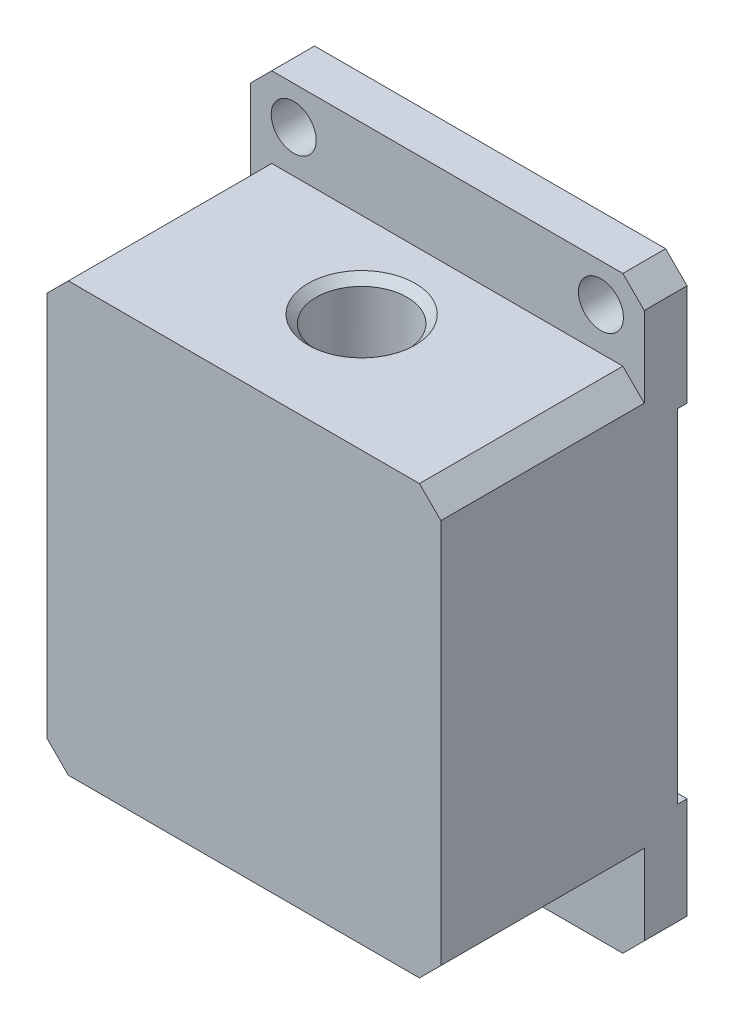
ISO-10303-21;
HEADER;
FILE_DESCRIPTION(('STEP AP214'),'2;1');
FILE_NAME('part.step','',(''),(''),'','','');
FILE_SCHEMA(('AUTOMOTIVE_DESIGN { 1 0 10303 214 1 1 1 1 }'));
ENDSEC;
DATA;
#1=APPLICATION_CONTEXT('core data for automotive mechanical design processes');
#2=APPLICATION_PROTOCOL_DEFINITION('international standard','automotive_design',2000,#1);
#3=PRODUCT_CONTEXT('',#1,'mechanical');
#4=PRODUCT('Part','Part','',(#3));
#5=PRODUCT_RELATED_PRODUCT_CATEGORY('part','',(#4));
#6=PRODUCT_DEFINITION_FORMATION('','',#4);
#7=PRODUCT_DEFINITION_CONTEXT('part definition',#1,'design');
#8=PRODUCT_DEFINITION('design','',#6,#7);
#9=PRODUCT_DEFINITION_SHAPE('','',#8);
#10=(LENGTH_UNIT() NAMED_UNIT(*) SI_UNIT(.MILLI.,.METRE.));
#11=(NAMED_UNIT(*) PLANE_ANGLE_UNIT() SI_UNIT($,.RADIAN.));
#12=(NAMED_UNIT(*) SI_UNIT($,.STERADIAN.) SOLID_ANGLE_UNIT());
#13=UNCERTAINTY_MEASURE_WITH_UNIT(LENGTH_MEASURE(1.E-05),#10,'distance_accuracy_value','');
#14=(GEOMETRIC_REPRESENTATION_CONTEXT(3) GLOBAL_UNCERTAINTY_ASSIGNED_CONTEXT((#13)) GLOBAL_UNIT_ASSIGNED_CONTEXT((#10,
#11,#12)) REPRESENTATION_CONTEXT('',''));
#15=CARTESIAN_POINT('',(0.,0.,0.));
#16=DIRECTION('',(0.,0.,1.));
#17=DIRECTION('',(1.,0.,0.));
#18=AXIS2_PLACEMENT_3D('',#15,#16,#17);
#19=CARTESIAN_POINT('',(-18.4,18.,-4.));
#20=DIRECTION('',(0.707106781186548,-0.707106781186548,0.));
#21=DIRECTION('',(0.,0.,-1.));
#22=AXIS2_PLACEMENT_3D('',#19,#20,#21);
#23=PLANE('',#22);
#24=DIRECTION('',(-0.707106781186548,-0.707106781186548,0.));
#25=VECTOR('',#24,1.);
#26=CARTESIAN_POINT('',(-18.2,18.2,19.));
#27=LINE('',#26,#25);
#28=CARTESIAN_POINT('',(-16.4,20.,19.));
#29=VERTEX_POINT('',#28);
#30=CARTESIAN_POINT('',(-18.4,18.,19.));
#31=VERTEX_POINT('',#30);
#32=EDGE_CURVE('E325',#29,#31,#27,.T.);
#33=ORIENTED_EDGE('',*,*,#32,.F.);
#34=DIRECTION('',(0.,0.,1.));
#35=VECTOR('',#34,1.);
#36=CARTESIAN_POINT('',(-16.4,20.,19.));
#37=LINE('',#36,#35);
#38=CARTESIAN_POINT('',(-16.4,20.,0.));
#39=VERTEX_POINT('',#38);
#40=EDGE_CURVE('E320',#39,#29,#37,.T.);
#41=ORIENTED_EDGE('',*,*,#40,.F.);
#42=DIRECTION('',(0.707106781186548,0.707106781186548,0.));
#43=VECTOR('',#42,1.);
#44=CARTESIAN_POINT('',(-18.2,18.2,0.));
#45=LINE('',#44,#43);
#46=CARTESIAN_POINT('',(-18.4,18.,0.));
#47=VERTEX_POINT('',#46);
#48=EDGE_CURVE('E396',#47,#39,#45,.T.);
#49=ORIENTED_EDGE('',*,*,#48,.F.);
#50=DIRECTION('',(0.,0.,-1.));
#51=VECTOR('',#50,1.);
#52=CARTESIAN_POINT('',(-18.4,18.,-4.));
#53=LINE('',#52,#51);
#54=EDGE_CURVE('E267',#31,#47,#53,.T.);
#55=ORIENTED_EDGE('',*,*,#54,.F.);
#56=EDGE_LOOP('',(#33,#41,#49,#55));
#57=FACE_BOUND('',#56,.T.);
#58=ADVANCED_FACE('F15',(#57),#23,.F.);
#59=CARTESIAN_POINT('',(16.4,20.,19.));
#60=DIRECTION('',(-0.707106781186547,-0.707106781186548,0.));
#61=DIRECTION('',(-0.707106781186548,0.707106781186547,0.));
#62=AXIS2_PLACEMENT_3D('',#59,#60,#61);
#63=PLANE('',#62);
#64=DIRECTION('',(-0.707106781186548,0.707106781186547,0.));
#65=VECTOR('',#64,1.);
#66=CARTESIAN_POINT('',(18.2,18.2,19.));
#67=LINE('',#66,#65);
#68=CARTESIAN_POINT('',(18.4,18.,19.));
#69=VERTEX_POINT('',#68);
#70=CARTESIAN_POINT('',(16.4,20.,19.));
#71=VERTEX_POINT('',#70);
#72=EDGE_CURVE('E300',#69,#71,#67,.T.);
#73=ORIENTED_EDGE('',*,*,#72,.F.);
#74=DIRECTION('',(0.,0.,1.));
#75=VECTOR('',#74,1.);
#76=CARTESIAN_POINT('',(18.4,18.,-4.));
#77=LINE('',#76,#75);
#78=CARTESIAN_POINT('',(18.4,18.,0.));
#79=VERTEX_POINT('',#78);
#80=EDGE_CURVE('E269',#79,#69,#77,.T.);
#81=ORIENTED_EDGE('',*,*,#80,.F.);
#82=DIRECTION('',(0.707106781186548,-0.707106781186547,0.));
#83=VECTOR('',#82,1.);
#84=CARTESIAN_POINT('',(18.2,18.2,0.));
#85=LINE('',#84,#83);
#86=CARTESIAN_POINT('',(16.4,20.,0.));
#87=VERTEX_POINT('',#86);
#88=EDGE_CURVE('E256',#87,#79,#85,.T.);
#89=ORIENTED_EDGE('',*,*,#88,.F.);
#90=DIRECTION('',(0.,0.,-1.));
#91=VECTOR('',#90,1.);
#92=CARTESIAN_POINT('',(16.4,20.,19.));
#93=LINE('',#92,#91);
#94=EDGE_CURVE('E389',#71,#87,#93,.T.);
#95=ORIENTED_EDGE('',*,*,#94,.F.);
#96=EDGE_LOOP('',(#73,#81,#89,#95));
#97=FACE_BOUND('',#96,.T.);
#98=ADVANCED_FACE('F483',(#97),#63,.F.);
#99=CARTESIAN_POINT('',(18.4,-18.,-4.));
#100=DIRECTION('',(-0.707106781186548,0.707106781186547,0.));
#101=DIRECTION('',(0.,0.,1.));
#102=AXIS2_PLACEMENT_3D('',#99,#100,#101);
#103=PLANE('',#102);
#104=DIRECTION('',(0.707106781186547,0.707106781186548,0.));
#105=VECTOR('',#104,1.);
#106=CARTESIAN_POINT('',(18.2,-18.2,19.));
#107=LINE('',#106,#105);
#108=CARTESIAN_POINT('',(16.4,-20.,19.));
#109=VERTEX_POINT('',#108);
#110=CARTESIAN_POINT('',(18.4,-18.,19.));
#111=VERTEX_POINT('',#110);
#112=EDGE_CURVE('E93',#109,#111,#107,.T.);
#113=ORIENTED_EDGE('',*,*,#112,.F.);
#114=DIRECTION('',(0.,0.,1.));
#115=VECTOR('',#114,1.);
#116=CARTESIAN_POINT('',(16.4,-20.,19.));
#117=LINE('',#116,#115);
#118=CARTESIAN_POINT('',(16.4,-20.,0.));
#119=VERTEX_POINT('',#118);
#120=EDGE_CURVE('E297',#119,#109,#117,.T.);
#121=ORIENTED_EDGE('',*,*,#120,.F.);
#122=DIRECTION('',(-0.707106781186547,-0.707106781186548,0.));
#123=VECTOR('',#122,1.);
#124=CARTESIAN_POINT('',(18.2,-18.2,0.));
#125=LINE('',#124,#123);
#126=CARTESIAN_POINT('',(18.4,-18.,0.));
#127=VERTEX_POINT('',#126);
#128=EDGE_CURVE('E374',#127,#119,#125,.T.);
#129=ORIENTED_EDGE('',*,*,#128,.F.);
#130=DIRECTION('',(0.,0.,-1.));
#131=VECTOR('',#130,1.);
#132=CARTESIAN_POINT('',(18.4,-18.,-4.));
#133=LINE('',#132,#131);
#134=EDGE_CURVE('E380',#111,#127,#133,.T.);
#135=ORIENTED_EDGE('',*,*,#134,.F.);
#136=EDGE_LOOP('',(#113,#121,#129,#135));
#137=FACE_BOUND('',#136,.T.);
#138=ADVANCED_FACE('F491',(#137),#103,.F.);
#139=CARTESIAN_POINT('',(-16.4,-20.,19.));
#140=DIRECTION('',(0.707106781186548,0.707106781186548,0.));
#141=DIRECTION('',(0.,0.,-1.));
#142=AXIS2_PLACEMENT_3D('',#139,#140,#141);
#143=PLANE('',#142);
#144=DIRECTION('',(0.707106781186548,-0.707106781186548,0.));
#145=VECTOR('',#144,1.);
#146=CARTESIAN_POINT('',(-18.2,-18.2,19.));
#147=LINE('',#146,#145);
#148=CARTESIAN_POINT('',(-18.4,-18.,19.));
#149=VERTEX_POINT('',#148);
#150=CARTESIAN_POINT('',(-16.4,-20.,19.));
#151=VERTEX_POINT('',#150);
#152=EDGE_CURVE('E301',#149,#151,#147,.T.);
#153=ORIENTED_EDGE('',*,*,#152,.F.);
#154=DIRECTION('',(0.,0.,1.));
#155=VECTOR('',#154,1.);
#156=CARTESIAN_POINT('',(-18.4,-18.,-4.));
#157=LINE('',#156,#155);
#158=CARTESIAN_POINT('',(-18.4,-18.,0.));
#159=VERTEX_POINT('',#158);
#160=EDGE_CURVE('E268',#159,#149,#157,.T.);
#161=ORIENTED_EDGE('',*,*,#160,.F.);
#162=DIRECTION('',(-0.707106781186548,0.707106781186548,0.));
#163=VECTOR('',#162,1.);
#164=CARTESIAN_POINT('',(-18.2,-18.2,0.));
#165=LINE('',#164,#163);
#166=CARTESIAN_POINT('',(-16.4,-20.,0.));
#167=VERTEX_POINT('',#166);
#168=EDGE_CURVE('E415',#167,#159,#165,.T.);
#169=ORIENTED_EDGE('',*,*,#168,.F.);
#170=DIRECTION('',(0.,0.,-1.));
#171=VECTOR('',#170,1.);
#172=CARTESIAN_POINT('',(-16.4,-20.,19.));
#173=LINE('',#172,#171);
#174=EDGE_CURVE('E294',#151,#167,#173,.T.);
#175=ORIENTED_EDGE('',*,*,#174,.F.);
#176=EDGE_LOOP('',(#153,#161,#169,#175));
#177=FACE_BOUND('',#176,.T.);
#178=ADVANCED_FACE('F622',(#177),#143,.F.);
#179=CARTESIAN_POINT('',(18.4,-25.5,-4.));
#180=DIRECTION('',(-0.707106781186546,0.707106781186549,0.));
#181=DIRECTION('',(0.,0.,1.));
#182=AXIS2_PLACEMENT_3D('',#179,#180,#181);
#183=PLANE('',#182);
#184=DIRECTION('',(0.707106781186549,0.707106781186546,0.));
#185=VECTOR('',#184,1.);
#186=CARTESIAN_POINT('',(18.4,-25.5,0.));
#187=LINE('',#186,#185);
#188=CARTESIAN_POINT('',(16.4,-27.5,0.));
#189=VERTEX_POINT('',#188);
#190=CARTESIAN_POINT('',(18.4,-25.5,0.));
#191=VERTEX_POINT('',#190);
#192=EDGE_CURVE('E279',#189,#191,#187,.T.);
#193=ORIENTED_EDGE('',*,*,#192,.F.);
#194=DIRECTION('',(0.,0.,1.));
#195=VECTOR('',#194,1.);
#196=CARTESIAN_POINT('',(16.4,-27.5,-4.));
#197=LINE('',#196,#195);
#198=CARTESIAN_POINT('',(16.4,-27.5,-4.));
#199=VERTEX_POINT('',#198);
#200=EDGE_CURVE('E422',#199,#189,#197,.T.);
#201=ORIENTED_EDGE('',*,*,#200,.F.);
#202=DIRECTION('',(-0.707106781186549,-0.707106781186546,0.));
#203=VECTOR('',#202,1.);
#204=CARTESIAN_POINT('',(21.95,-21.95,-4.));
#205=LINE('',#204,#203);
#206=CARTESIAN_POINT('',(18.4,-25.5,-4.));
#207=VERTEX_POINT('',#206);
#208=EDGE_CURVE('E302',#207,#199,#205,.T.);
#209=ORIENTED_EDGE('',*,*,#208,.F.);
#210=DIRECTION('',(0.,0.,-1.));
#211=VECTOR('',#210,1.);
#212=CARTESIAN_POINT('',(18.4,-25.5,-4.));
#213=LINE('',#212,#211);
#214=EDGE_CURVE('E252',#191,#207,#213,.T.);
#215=ORIENTED_EDGE('',*,*,#214,.F.);
#216=EDGE_LOOP('',(#193,#201,#209,#215));
#217=FACE_BOUND('',#216,.T.);
#218=ADVANCED_FACE('F503',(#217),#183,.F.);
#219=CARTESIAN_POINT('',(-16.4,-27.5,-4.));
#220=DIRECTION('',(0.707106781186547,0.707106781186548,0.));
#221=DIRECTION('',(0.,0.,-1.));
#222=AXIS2_PLACEMENT_3D('',#219,#220,#221);
#223=PLANE('',#222);
#224=DIRECTION('',(0.707106781186548,-0.707106781186547,0.));
#225=VECTOR('',#224,1.);
#226=CARTESIAN_POINT('',(-16.4,-27.5,0.));
#227=LINE('',#226,#225);
#228=CARTESIAN_POINT('',(-18.4,-25.5,0.));
#229=VERTEX_POINT('',#228);
#230=CARTESIAN_POINT('',(-16.4,-27.5,0.));
#231=VERTEX_POINT('',#230);
#232=EDGE_CURVE('E261',#229,#231,#227,.T.);
#233=ORIENTED_EDGE('',*,*,#232,.F.);
#234=DIRECTION('',(0.,0.,1.));
#235=VECTOR('',#234,1.);
#236=CARTESIAN_POINT('',(-18.4,-25.5,-4.));
#237=LINE('',#236,#235);
#238=CARTESIAN_POINT('',(-18.4,-25.5,-4.));
#239=VERTEX_POINT('',#238);
#240=EDGE_CURVE('E289',#239,#229,#237,.T.);
#241=ORIENTED_EDGE('',*,*,#240,.F.);
#242=DIRECTION('',(-0.707106781186548,0.707106781186547,0.));
#243=VECTOR('',#242,1.);
#244=CARTESIAN_POINT('',(-21.95,-21.95,-4.));
#245=LINE('',#244,#243);
#246=CARTESIAN_POINT('',(-16.4,-27.5,-4.));
#247=VERTEX_POINT('',#246);
#248=EDGE_CURVE('E397',#247,#239,#245,.T.);
#249=ORIENTED_EDGE('',*,*,#248,.F.);
#250=DIRECTION('',(0.,0.,-1.));
#251=VECTOR('',#250,1.);
#252=CARTESIAN_POINT('',(-16.4,-27.5,-4.));
#253=LINE('',#252,#251);
#254=EDGE_CURVE('E419',#231,#247,#253,.T.);
#255=ORIENTED_EDGE('',*,*,#254,.F.);
#256=EDGE_LOOP('',(#233,#241,#249,#255));
#257=FACE_BOUND('',#256,.T.);
#258=ADVANCED_FACE('F550',(#257),#223,.F.);
#259=CARTESIAN_POINT('',(16.4,27.5,-4.));
#260=DIRECTION('',(-0.707106781186547,-0.707106781186548,0.));
#261=DIRECTION('',(-0.707106781186548,0.707106781186547,0.));
#262=AXIS2_PLACEMENT_3D('',#259,#260,#261);
#263=PLANE('',#262);
#264=DIRECTION('',(-0.707106781186548,0.707106781186547,0.));
#265=VECTOR('',#264,1.);
#266=CARTESIAN_POINT('',(16.4,27.5,0.));
#267=LINE('',#266,#265);
#268=CARTESIAN_POINT('',(18.4,25.5,0.));
#269=VERTEX_POINT('',#268);
#270=CARTESIAN_POINT('',(16.4,27.5,0.));
#271=VERTEX_POINT('',#270);
#272=EDGE_CURVE('E310',#269,#271,#267,.T.);
#273=ORIENTED_EDGE('',*,*,#272,.F.);
#274=DIRECTION('',(0.,0.,1.));
#275=VECTOR('',#274,1.);
#276=CARTESIAN_POINT('',(18.4,25.5,-4.));
#277=LINE('',#276,#275);
#278=CARTESIAN_POINT('',(18.4,25.5,-4.));
#279=VERTEX_POINT('',#278);
#280=EDGE_CURVE('E274',#279,#269,#277,.T.);
#281=ORIENTED_EDGE('',*,*,#280,.F.);
#282=DIRECTION('',(0.707106781186548,-0.707106781186547,0.));
#283=VECTOR('',#282,1.);
#284=CARTESIAN_POINT('',(21.95,21.95,-4.));
#285=LINE('',#284,#283);
#286=CARTESIAN_POINT('',(16.4,27.5,-4.));
#287=VERTEX_POINT('',#286);
#288=EDGE_CURVE('E407',#287,#279,#285,.T.);
#289=ORIENTED_EDGE('',*,*,#288,.F.);
#290=DIRECTION('',(0.,0.,-1.));
#291=VECTOR('',#290,1.);
#292=CARTESIAN_POINT('',(16.4,27.5,-4.));
#293=LINE('',#292,#291);
#294=EDGE_CURVE('E364',#271,#287,#293,.T.);
#295=ORIENTED_EDGE('',*,*,#294,.F.);
#296=EDGE_LOOP('',(#273,#281,#289,#295));
#297=FACE_BOUND('',#296,.T.);
#298=ADVANCED_FACE('F471',(#297),#263,.F.);
#299=CARTESIAN_POINT('',(-18.4,25.5,-4.));
#300=DIRECTION('',(0.707106781186546,-0.707106781186549,0.));
#301=DIRECTION('',(0.,0.,-1.));
#302=AXIS2_PLACEMENT_3D('',#299,#300,#301);
#303=PLANE('',#302);
#304=DIRECTION('',(-0.707106781186549,-0.707106781186546,0.));
#305=VECTOR('',#304,1.);
#306=CARTESIAN_POINT('',(-18.4,25.5,0.));
#307=LINE('',#306,#305);
#308=CARTESIAN_POINT('',(-16.4,27.5,0.));
#309=VERTEX_POINT('',#308);
#310=CARTESIAN_POINT('',(-18.4,25.5,0.));
#311=VERTEX_POINT('',#310);
#312=EDGE_CURVE('E284',#309,#311,#307,.T.);
#313=ORIENTED_EDGE('',*,*,#312,.F.);
#314=DIRECTION('',(0.,0.,1.));
#315=VECTOR('',#314,1.);
#316=CARTESIAN_POINT('',(-16.4,27.5,-4.));
#317=LINE('',#316,#315);
#318=CARTESIAN_POINT('',(-16.4,27.5,-4.));
#319=VERTEX_POINT('',#318);
#320=EDGE_CURVE('E361',#319,#309,#317,.T.);
#321=ORIENTED_EDGE('',*,*,#320,.F.);
#322=DIRECTION('',(0.707106781186549,0.707106781186546,0.));
#323=VECTOR('',#322,1.);
#324=CARTESIAN_POINT('',(-21.95,21.95,-4.));
#325=LINE('',#324,#323);
#326=CARTESIAN_POINT('',(-18.4,25.5,-4.));
#327=VERTEX_POINT('',#326);
#328=EDGE_CURVE('E349',#327,#319,#325,.T.);
#329=ORIENTED_EDGE('',*,*,#328,.F.);
#330=DIRECTION('',(0.,0.,-1.));
#331=VECTOR('',#330,1.);
#332=CARTESIAN_POINT('',(-18.4,25.5,-4.));
#333=LINE('',#332,#331);
#334=EDGE_CURVE('E443',#311,#327,#333,.T.);
#335=ORIENTED_EDGE('',*,*,#334,.F.);
#336=EDGE_LOOP('',(#313,#321,#329,#335));
#337=FACE_BOUND('',#336,.T.);
#338=ADVANCED_FACE('F533',(#337),#303,.F.);
#339=CARTESIAN_POINT('',(0.,0.,-3.1));
#340=DIRECTION('',(0.,0.,-1.));
#341=DIRECTION('',(0.,-1.,0.));
#342=AXIS2_PLACEMENT_3D('',#339,#340,#341);
#343=PLANE('',#342);
#344=DIRECTION('',(-1.,0.,0.));
#345=VECTOR('',#344,1.);
#346=CARTESIAN_POINT('',(-18.4,16.,-3.1));
#347=LINE('',#346,#345);
#348=CARTESIAN_POINT('',(18.4,16.,-3.1));
#349=VERTEX_POINT('',#348);
#350=CARTESIAN_POINT('',(-18.4,16.,-3.1));
#351=VERTEX_POINT('',#350);
#352=EDGE_CURVE('E19',#349,#351,#347,.T.);
#353=ORIENTED_EDGE('',*,*,#352,.F.);
#354=DIRECTION('',(0.,-1.,0.));
#355=VECTOR('',#354,1.);
#356=CARTESIAN_POINT('',(18.4,16.,-3.1));
#357=LINE('',#356,#355);
#358=CARTESIAN_POINT('',(18.4,-16.,-3.1));
#359=VERTEX_POINT('',#358);
#360=EDGE_CURVE('E224',#349,#359,#357,.T.);
#361=ORIENTED_EDGE('',*,*,#360,.T.);
#362=DIRECTION('',(1.,0.,0.));
#363=VECTOR('',#362,1.);
#364=CARTESIAN_POINT('',(18.4,-16.,-3.1));
#365=LINE('',#364,#363);
#366=CARTESIAN_POINT('',(-18.4,-16.,-3.1));
#367=VERTEX_POINT('',#366);
#368=EDGE_CURVE('E9',#367,#359,#365,.T.);
#369=ORIENTED_EDGE('',*,*,#368,.F.);
#370=DIRECTION('',(0.,1.,0.));
#371=VECTOR('',#370,1.);
#372=CARTESIAN_POINT('',(-18.4,-16.,-3.1));
#373=LINE('',#372,#371);
#374=EDGE_CURVE('E227',#367,#351,#373,.T.);
#375=ORIENTED_EDGE('',*,*,#374,.T.);
#376=EDGE_LOOP('',(#353,#361,#369,#375));
#377=FACE_BOUND('',#376,.T.);
#378=ADVANCED_FACE('F221',(#377),#343,.T.);
#379=CARTESIAN_POINT('',(18.4,-16.,-3.1));
#380=DIRECTION('',(0.,-1.,0.));
#381=DIRECTION('',(0.,0.,-1.));
#382=AXIS2_PLACEMENT_3D('',#379,#380,#381);
#383=PLANE('',#382);
#384=DIRECTION('',(-1.,0.,0.));
#385=VECTOR('',#384,1.);
#386=CARTESIAN_POINT('',(18.4,-16.,-4.));
#387=LINE('',#386,#385);
#388=CARTESIAN_POINT('',(18.4,-16.,-4.));
#389=VERTEX_POINT('',#388);
#390=CARTESIAN_POINT('',(-18.4,-16.,-4.));
#391=VERTEX_POINT('',#390);
#392=EDGE_CURVE('E373',#389,#391,#387,.T.);
#393=ORIENTED_EDGE('',*,*,#392,.T.);
#394=DIRECTION('',(0.,0.,-1.));
#395=VECTOR('',#394,1.);
#396=CARTESIAN_POINT('',(-18.4,-16.,-3.1));
#397=LINE('',#396,#395);
#398=EDGE_CURVE('E329',#367,#391,#397,.T.);
#399=ORIENTED_EDGE('',*,*,#398,.F.);
#400=ORIENTED_EDGE('',*,*,#368,.T.);
#401=DIRECTION('',(0.,0.,-1.));
#402=VECTOR('',#401,1.);
#403=CARTESIAN_POINT('',(18.4,-16.,-3.1));
#404=LINE('',#403,#402);
#405=EDGE_CURVE('E245',#359,#389,#404,.T.);
#406=ORIENTED_EDGE('',*,*,#405,.T.);
#407=EDGE_LOOP('',(#393,#399,#400,#406));
#408=FACE_BOUND('',#407,.T.);
#409=ADVANCED_FACE('F510',(#408),#383,.F.);
#410=CARTESIAN_POINT('',(-18.4,16.,-3.1));
#411=DIRECTION('',(0.,1.,0.));
#412=DIRECTION('',(1.,0.,0.));
#413=AXIS2_PLACEMENT_3D('',#410,#411,#412);
#414=PLANE('',#413);
#415=DIRECTION('',(1.,0.,0.));
#416=VECTOR('',#415,1.);
#417=CARTESIAN_POINT('',(-18.4,16.,-4.));
#418=LINE('',#417,#416);
#419=CARTESIAN_POINT('',(-18.4,16.,-4.));
#420=VERTEX_POINT('',#419);
#421=CARTESIAN_POINT('',(18.4,16.,-4.));
#422=VERTEX_POINT('',#421);
#423=EDGE_CURVE('E236',#420,#422,#418,.T.);
#424=ORIENTED_EDGE('',*,*,#423,.T.);
#425=DIRECTION('',(0.,0.,-1.));
#426=VECTOR('',#425,1.);
#427=CARTESIAN_POINT('',(18.4,16.,-3.1));
#428=LINE('',#427,#426);
#429=EDGE_CURVE('E233',#349,#422,#428,.T.);
#430=ORIENTED_EDGE('',*,*,#429,.F.);
#431=ORIENTED_EDGE('',*,*,#352,.T.);
#432=DIRECTION('',(0.,0.,-1.));
#433=VECTOR('',#432,1.);
#434=CARTESIAN_POINT('',(-18.4,16.,-3.1));
#435=LINE('',#434,#433);
#436=EDGE_CURVE('E344',#351,#420,#435,.T.);
#437=ORIENTED_EDGE('',*,*,#436,.T.);
#438=EDGE_LOOP('',(#424,#430,#431,#437));
#439=FACE_BOUND('',#438,.T.);
#440=ADVANCED_FACE('F234',(#439),#414,.F.);
#441=CARTESIAN_POINT('',(0.,20.,8.));
#442=DIRECTION('',(0.,1.,0.));
#443=DIRECTION('',(0.,0.,1.));
#444=AXIS2_PLACEMENT_3D('',#441,#442,#443);
#445=CONICAL_SURFACE('',#444,5.,0.7853981625);
#446=CARTESIAN_POINT('',(0.,20.,8.));
#447=DIRECTION('',(0.,-1.,0.));
#448=DIRECTION('',(0.,0.,-1.));
#449=AXIS2_PLACEMENT_3D('',#446,#447,#448);
#450=CIRCLE('',#449,5.);
#451=CARTESIAN_POINT('',(0.,20.,3.));
#452=VERTEX_POINT('',#451);
#453=EDGE_CURVE('E80',#452,#452,#450,.T.);
#454=ORIENTED_EDGE('',*,*,#453,.F.);
#455=EDGE_LOOP('',(#454));
#456=FACE_BOUND('',#455,.T.);
#457=CARTESIAN_POINT('',(0.,19.25,8.));
#458=DIRECTION('',(0.,1.,0.));
#459=DIRECTION('',(0.,0.,-1.));
#460=AXIS2_PLACEMENT_3D('',#457,#458,#459);
#461=CIRCLE('',#460,4.25);
#462=CARTESIAN_POINT('',(0.,19.25,3.75));
#463=VERTEX_POINT('',#462);
#464=EDGE_CURVE('E37',#463,#463,#461,.T.);
#465=ORIENTED_EDGE('',*,*,#464,.F.);
#466=EDGE_LOOP('',(#465));
#467=FACE_BOUND('',#466,.T.);
#468=ADVANCED_FACE('F619',(#456,#467),#445,.F.);
#469=CARTESIAN_POINT('',(0.,20.,8.));
#470=DIRECTION('',(0.,-1.,0.));
#471=DIRECTION('',(0.,0.,-1.));
#472=AXIS2_PLACEMENT_3D('',#469,#470,#471);
#473=CYLINDRICAL_SURFACE('',#472,4.25);
#474=CARTESIAN_POINT('',(0.,10.,8.));
#475=DIRECTION('',(0.,1.,0.));
#476=DIRECTION('',(0.,0.,-1.));
#477=AXIS2_PLACEMENT_3D('',#474,#475,#476);
#478=CIRCLE('',#477,4.25);
#479=CARTESIAN_POINT('',(0.,10.,3.75));
#480=VERTEX_POINT('',#479);
#481=EDGE_CURVE('E327',#480,#480,#478,.T.);
#482=ORIENTED_EDGE('',*,*,#481,.F.);
#483=EDGE_LOOP('',(#482));
#484=FACE_BOUND('',#483,.T.);
#485=ORIENTED_EDGE('',*,*,#464,.T.);
#486=EDGE_LOOP('',(#485));
#487=FACE_BOUND('',#486,.T.);
#488=ADVANCED_FACE('F583',(#484,#487),#473,.F.);
#489=CARTESIAN_POINT('',(0.,10.,8.));
#490=DIRECTION('',(0.,1.,0.));
#491=DIRECTION('',(0.,0.,1.));
#492=AXIS2_PLACEMENT_3D('',#489,#490,#491);
#493=CONICAL_SURFACE('',#492,4.25,1.0297442575);
#494=CARTESIAN_POINT('',(0.,7.44634236913287,8.));
#495=VERTEX_POINT('',#494);
#496=VERTEX_LOOP('',#495);
#497=FACE_BOUND('',#496,.T.);
#498=ORIENTED_EDGE('',*,*,#481,.T.);
#499=EDGE_LOOP('',(#498));
#500=FACE_BOUND('',#499,.T.);
#501=ADVANCED_FACE('F572',(#497,#500),#493,.F.);
#502=CARTESIAN_POINT('',(0.,-23.95,-19.));
#503=DIRECTION('',(0.,0.,1.));
#504=DIRECTION('',(1.,0.,0.));
#505=AXIS2_PLACEMENT_3D('',#502,#503,#504);
#506=CYLINDRICAL_SURFACE('',#505,2.1);
#507=CARTESIAN_POINT('',(0.,-23.95,0.));
#508=DIRECTION('',(0.,0.,-1.));
#509=DIRECTION('',(-1.,0.,0.));
#510=AXIS2_PLACEMENT_3D('',#507,#508,#509);
#511=CIRCLE('',#510,2.1);
#512=CARTESIAN_POINT('',(-2.1,-23.95,0.));
#513=VERTEX_POINT('',#512);
#514=EDGE_CURVE('E262',#513,#513,#511,.T.);
#515=ORIENTED_EDGE('',*,*,#514,.F.);
#516=EDGE_LOOP('',(#515));
#517=FACE_BOUND('',#516,.T.);
#518=CARTESIAN_POINT('',(0.,-23.95,-4.));
#519=DIRECTION('',(0.,0.,1.));
#520=DIRECTION('',(-1.,0.,0.));
#521=AXIS2_PLACEMENT_3D('',#518,#519,#520);
#522=CIRCLE('',#521,2.1);
#523=CARTESIAN_POINT('',(-2.1,-23.95,-4.));
#524=VERTEX_POINT('',#523);
#525=EDGE_CURVE('E306',#524,#524,#522,.T.);
#526=ORIENTED_EDGE('',*,*,#525,.F.);
#527=EDGE_LOOP('',(#526));
#528=FACE_BOUND('',#527,.T.);
#529=ADVANCED_FACE('F569',(#517,#528),#506,.F.);
#530=CARTESIAN_POINT('',(-14.35,23.95,-19.));
#531=DIRECTION('',(0.,0.,1.));
#532=DIRECTION('',(1.,0.,0.));
#533=AXIS2_PLACEMENT_3D('',#530,#531,#532);
#534=CYLINDRICAL_SURFACE('',#533,2.1);
#535=CARTESIAN_POINT('',(-14.35,23.95,0.));
#536=DIRECTION('',(0.,0.,1.));
#537=DIRECTION('',(-1.,0.,0.));
#538=AXIS2_PLACEMENT_3D('',#535,#536,#537);
#539=CIRCLE('',#538,2.1);
#540=CARTESIAN_POINT('',(-16.45,23.95,0.));
#541=VERTEX_POINT('',#540);
#542=EDGE_CURVE('E314',#541,#541,#539,.T.);
#543=ORIENTED_EDGE('',*,*,#542,.T.);
#544=EDGE_LOOP('',(#543));
#545=FACE_BOUND('',#544,.T.);
#546=CARTESIAN_POINT('',(-14.35,23.95,-4.));
#547=DIRECTION('',(0.,0.,-1.));
#548=DIRECTION('',(-1.,0.,0.));
#549=AXIS2_PLACEMENT_3D('',#546,#547,#548);
#550=CIRCLE('',#549,2.1);
#551=CARTESIAN_POINT('',(-16.45,23.95,-4.));
#552=VERTEX_POINT('',#551);
#553=EDGE_CURVE('E290',#552,#552,#550,.T.);
#554=ORIENTED_EDGE('',*,*,#553,.T.);
#555=EDGE_LOOP('',(#554));
#556=FACE_BOUND('',#555,.T.);
#557=ADVANCED_FACE('F571',(#545,#556),#534,.F.);
#558=CARTESIAN_POINT('',(14.35,23.95,-19.));
#559=DIRECTION('',(0.,0.,1.));
#560=DIRECTION('',(1.,0.,0.));
#561=AXIS2_PLACEMENT_3D('',#558,#559,#560);
#562=CYLINDRICAL_SURFACE('',#561,2.1);
#563=CARTESIAN_POINT('',(14.35,23.95,0.));
#564=DIRECTION('',(0.,0.,-1.));
#565=DIRECTION('',(1.,0.,0.));
#566=AXIS2_PLACEMENT_3D('',#563,#564,#565);
#567=CIRCLE('',#566,2.1);
#568=CARTESIAN_POINT('',(16.45,23.95,0.));
#569=VERTEX_POINT('',#568);
#570=EDGE_CURVE('E285',#569,#569,#567,.T.);
#571=ORIENTED_EDGE('',*,*,#570,.F.);
#572=EDGE_LOOP('',(#571));
#573=FACE_BOUND('',#572,.T.);
#574=CARTESIAN_POINT('',(14.35,23.95,-4.));
#575=DIRECTION('',(0.,0.,1.));
#576=DIRECTION('',(-1.,0.,0.));
#577=AXIS2_PLACEMENT_3D('',#574,#575,#576);
#578=CIRCLE('',#577,2.1);
#579=CARTESIAN_POINT('',(12.25,23.95,-4.));
#580=VERTEX_POINT('',#579);
#581=EDGE_CURVE('E293',#580,#580,#578,.T.);
#582=ORIENTED_EDGE('',*,*,#581,.F.);
#583=EDGE_LOOP('',(#582));
#584=FACE_BOUND('',#583,.T.);
#585=ADVANCED_FACE('F580',(#573,#584),#562,.F.);
#586=CARTESIAN_POINT('',(0.,0.,19.));
#587=DIRECTION('',(0.,0.,1.));
#588=DIRECTION('',(1.,0.,0.));
#589=AXIS2_PLACEMENT_3D('',#586,#587,#588);
#590=PLANE('',#589);
#591=DIRECTION('',(0.,-1.,0.));
#592=VECTOR('',#591,1.);
#593=CARTESIAN_POINT('',(-18.4,20.,19.));
#594=LINE('',#593,#592);
#595=EDGE_CURVE('E263',#31,#149,#594,.T.);
#596=ORIENTED_EDGE('',*,*,#595,.T.);
#597=ORIENTED_EDGE('',*,*,#152,.T.);
#598=DIRECTION('',(1.,0.,0.));
#599=VECTOR('',#598,1.);
#600=CARTESIAN_POINT('',(-18.4,-20.,19.));
#601=LINE('',#600,#599);
#602=EDGE_CURVE('E241',#151,#109,#601,.T.);
#603=ORIENTED_EDGE('',*,*,#602,.T.);
#604=ORIENTED_EDGE('',*,*,#112,.T.);
#605=DIRECTION('',(0.,1.,0.));
#606=VECTOR('',#605,1.);
#607=CARTESIAN_POINT('',(18.4,-20.,19.));
#608=LINE('',#607,#606);
#609=EDGE_CURVE('E273',#111,#69,#608,.T.);
#610=ORIENTED_EDGE('',*,*,#609,.T.);
#611=ORIENTED_EDGE('',*,*,#72,.T.);
#612=DIRECTION('',(-1.,0.,0.));
#613=VECTOR('',#612,1.);
#614=CARTESIAN_POINT('',(18.4,20.,19.));
#615=LINE('',#614,#613);
#616=EDGE_CURVE('E385',#71,#29,#615,.T.);
#617=ORIENTED_EDGE('',*,*,#616,.T.);
#618=ORIENTED_EDGE('',*,*,#32,.T.);
#619=EDGE_LOOP('',(#596,#597,#603,#604,#610,#611,#617,#618));
#620=FACE_BOUND('',#619,.T.);
#621=ADVANCED_FACE('F489',(#620),#590,.T.);
#622=CARTESIAN_POINT('',(18.4,20.,19.));
#623=DIRECTION('',(0.,-1.,0.));
#624=DIRECTION('',(0.,0.,-1.));
#625=AXIS2_PLACEMENT_3D('',#622,#623,#624);
#626=PLANE('',#625);
#627=ORIENTED_EDGE('',*,*,#616,.F.);
#628=ORIENTED_EDGE('',*,*,#94,.T.);
#629=DIRECTION('',(-1.,0.,0.));
#630=VECTOR('',#629,1.);
#631=CARTESIAN_POINT('',(18.4,20.,0.));
#632=LINE('',#631,#630);
#633=EDGE_CURVE('E436',#87,#39,#632,.T.);
#634=ORIENTED_EDGE('',*,*,#633,.T.);
#635=ORIENTED_EDGE('',*,*,#40,.T.);
#636=EDGE_LOOP('',(#627,#628,#634,#635));
#637=FACE_BOUND('',#636,.T.);
#638=ORIENTED_EDGE('',*,*,#453,.T.);
#639=EDGE_LOOP('',(#638));
#640=FACE_BOUND('',#639,.T.);
#641=ADVANCED_FACE('F607',(#637,#640),#626,.F.);
#642=CARTESIAN_POINT('',(-18.4,-20.,19.));
#643=DIRECTION('',(0.,1.,0.));
#644=DIRECTION('',(1.,0.,0.));
#645=AXIS2_PLACEMENT_3D('',#642,#643,#644);
#646=PLANE('',#645);
#647=ORIENTED_EDGE('',*,*,#602,.F.);
#648=ORIENTED_EDGE('',*,*,#174,.T.);
#649=DIRECTION('',(1.,0.,0.));
#650=VECTOR('',#649,1.);
#651=CARTESIAN_POINT('',(-18.4,-20.,0.));
#652=LINE('',#651,#650);
#653=EDGE_CURVE('E378',#167,#119,#652,.T.);
#654=ORIENTED_EDGE('',*,*,#653,.T.);
#655=ORIENTED_EDGE('',*,*,#120,.T.);
#656=EDGE_LOOP('',(#647,#648,#654,#655));
#657=FACE_BOUND('',#656,.T.);
#658=ADVANCED_FACE('F600',(#657),#646,.F.);
#659=CARTESIAN_POINT('',(18.4,27.5,-4.));
#660=DIRECTION('',(-1.,0.,0.));
#661=DIRECTION('',(0.,1.,0.));
#662=AXIS2_PLACEMENT_3D('',#659,#660,#661);
#663=PLANE('',#662);
#664=DIRECTION('',(0.,1.,0.));
#665=VECTOR('',#664,1.);
#666=CARTESIAN_POINT('',(18.4,27.5,-4.));
#667=LINE('',#666,#665);
#668=EDGE_CURVE('E411',#422,#279,#667,.T.);
#669=ORIENTED_EDGE('',*,*,#668,.T.);
#670=ORIENTED_EDGE('',*,*,#280,.T.);
#671=DIRECTION('',(0.,1.,0.));
#672=VECTOR('',#671,1.);
#673=CARTESIAN_POINT('',(18.4,27.5,0.));
#674=LINE('',#673,#672);
#675=EDGE_CURVE('E315',#79,#269,#674,.T.);
#676=ORIENTED_EDGE('',*,*,#675,.F.);
#677=ORIENTED_EDGE('',*,*,#80,.T.);
#678=ORIENTED_EDGE('',*,*,#609,.F.);
#679=ORIENTED_EDGE('',*,*,#134,.T.);
#680=DIRECTION('',(0.,1.,0.));
#681=VECTOR('',#680,1.);
#682=CARTESIAN_POINT('',(18.4,27.5,0.));
#683=LINE('',#682,#681);
#684=EDGE_CURVE('E379',#191,#127,#683,.T.);
#685=ORIENTED_EDGE('',*,*,#684,.F.);
#686=ORIENTED_EDGE('',*,*,#214,.T.);
#687=DIRECTION('',(0.,1.,0.));
#688=VECTOR('',#687,1.);
#689=CARTESIAN_POINT('',(18.4,27.5,-4.));
#690=LINE('',#689,#688);
#691=EDGE_CURVE('E307',#207,#389,#690,.T.);
#692=ORIENTED_EDGE('',*,*,#691,.T.);
#693=ORIENTED_EDGE('',*,*,#405,.F.);
#694=ORIENTED_EDGE('',*,*,#360,.F.);
#695=ORIENTED_EDGE('',*,*,#429,.T.);
#696=EDGE_LOOP('',(#669,#670,#676,#677,#678,#679,#685,#686,#692,#693,#694,#695));
#697=FACE_BOUND('',#696,.T.);
#698=ADVANCED_FACE('F243',(#697),#663,.F.);
#699=CARTESIAN_POINT('',(-18.4,27.5,-4.));
#700=DIRECTION('',(0.,-1.,0.));
#701=DIRECTION('',(0.,0.,-1.));
#702=AXIS2_PLACEMENT_3D('',#699,#700,#701);
#703=PLANE('',#702);
#704=DIRECTION('',(-1.,0.,0.));
#705=VECTOR('',#704,1.);
#706=CARTESIAN_POINT('',(-18.4,27.5,-4.));
#707=LINE('',#706,#705);
#708=EDGE_CURVE('E352',#287,#319,#707,.T.);
#709=ORIENTED_EDGE('',*,*,#708,.T.);
#710=ORIENTED_EDGE('',*,*,#320,.T.);
#711=DIRECTION('',(-1.,0.,0.));
#712=VECTOR('',#711,1.);
#713=CARTESIAN_POINT('',(-18.4,27.5,0.));
#714=LINE('',#713,#712);
#715=EDGE_CURVE('E280',#271,#309,#714,.T.);
#716=ORIENTED_EDGE('',*,*,#715,.F.);
#717=ORIENTED_EDGE('',*,*,#294,.T.);
#718=EDGE_LOOP('',(#709,#710,#716,#717));
#719=FACE_BOUND('',#718,.T.);
#720=ADVANCED_FACE('F17',(#719),#703,.F.);
#721=CARTESIAN_POINT('',(-18.4,-27.5,-4.));
#722=DIRECTION('',(1.,0.,0.));
#723=DIRECTION('',(0.,1.,0.));
#724=AXIS2_PLACEMENT_3D('',#721,#722,#723);
#725=PLANE('',#724);
#726=DIRECTION('',(0.,-1.,0.));
#727=VECTOR('',#726,1.);
#728=CARTESIAN_POINT('',(-18.4,-27.5,0.));
#729=LINE('',#728,#727);
#730=EDGE_CURVE('E324',#311,#47,#729,.T.);
#731=ORIENTED_EDGE('',*,*,#730,.F.);
#732=ORIENTED_EDGE('',*,*,#334,.T.);
#733=DIRECTION('',(0.,-1.,0.));
#734=VECTOR('',#733,1.);
#735=CARTESIAN_POINT('',(-18.4,-27.5,-4.));
#736=LINE('',#735,#734);
#737=EDGE_CURVE('E353',#327,#420,#736,.T.);
#738=ORIENTED_EDGE('',*,*,#737,.T.);
#739=ORIENTED_EDGE('',*,*,#436,.F.);
#740=ORIENTED_EDGE('',*,*,#374,.F.);
#741=ORIENTED_EDGE('',*,*,#398,.T.);
#742=DIRECTION('',(0.,-1.,0.));
#743=VECTOR('',#742,1.);
#744=CARTESIAN_POINT('',(-18.4,-27.5,-4.));
#745=LINE('',#744,#743);
#746=EDGE_CURVE('E401',#391,#239,#745,.T.);
#747=ORIENTED_EDGE('',*,*,#746,.T.);
#748=ORIENTED_EDGE('',*,*,#240,.T.);
#749=DIRECTION('',(0.,-1.,0.));
#750=VECTOR('',#749,1.);
#751=CARTESIAN_POINT('',(-18.4,-27.5,0.));
#752=LINE('',#751,#750);
#753=EDGE_CURVE('E258',#159,#229,#752,.T.);
#754=ORIENTED_EDGE('',*,*,#753,.F.);
#755=ORIENTED_EDGE('',*,*,#160,.T.);
#756=ORIENTED_EDGE('',*,*,#595,.F.);
#757=ORIENTED_EDGE('',*,*,#54,.T.);
#758=EDGE_LOOP('',(#731,#732,#738,#739,#740,#741,#747,#748,#754,#755,#756,#757));
#759=FACE_BOUND('',#758,.T.);
#760=ADVANCED_FACE('F530',(#759),#725,.F.);
#761=CARTESIAN_POINT('',(18.4,-27.5,-4.));
#762=DIRECTION('',(0.,1.,0.));
#763=DIRECTION('',(1.,0.,0.));
#764=AXIS2_PLACEMENT_3D('',#761,#762,#763);
#765=PLANE('',#764);
#766=DIRECTION('',(1.,0.,0.));
#767=VECTOR('',#766,1.);
#768=CARTESIAN_POINT('',(18.4,-27.5,0.));
#769=LINE('',#768,#767);
#770=EDGE_CURVE('E275',#231,#189,#769,.T.);
#771=ORIENTED_EDGE('',*,*,#770,.F.);
#772=ORIENTED_EDGE('',*,*,#254,.T.);
#773=DIRECTION('',(1.,0.,0.));
#774=VECTOR('',#773,1.);
#775=CARTESIAN_POINT('',(18.4,-27.5,-4.));
#776=LINE('',#775,#774);
#777=EDGE_CURVE('E367',#247,#199,#776,.T.);
#778=ORIENTED_EDGE('',*,*,#777,.T.);
#779=ORIENTED_EDGE('',*,*,#200,.T.);
#780=EDGE_LOOP('',(#771,#772,#778,#779));
#781=FACE_BOUND('',#780,.T.);
#782=ADVANCED_FACE('F548',(#781),#765,.F.);
#783=CARTESIAN_POINT('',(0.,0.,0.));
#784=DIRECTION('',(0.,0.,-1.));
#785=DIRECTION('',(0.,-1.,0.));
#786=AXIS2_PLACEMENT_3D('',#783,#784,#785);
#787=PLANE('',#786);
#788=ORIENTED_EDGE('',*,*,#753,.T.);
#789=ORIENTED_EDGE('',*,*,#232,.T.);
#790=ORIENTED_EDGE('',*,*,#770,.T.);
#791=ORIENTED_EDGE('',*,*,#192,.T.);
#792=ORIENTED_EDGE('',*,*,#684,.T.);
#793=ORIENTED_EDGE('',*,*,#128,.T.);
#794=ORIENTED_EDGE('',*,*,#653,.F.);
#795=ORIENTED_EDGE('',*,*,#168,.T.);
#796=EDGE_LOOP('',(#788,#789,#790,#791,#792,#793,#794,#795));
#797=FACE_BOUND('',#796,.T.);
#798=ORIENTED_EDGE('',*,*,#514,.T.);
#799=EDGE_LOOP('',(#798));
#800=FACE_BOUND('',#799,.T.);
#801=ADVANCED_FACE('F494',(#797,#800),#787,.F.);
#802=CARTESIAN_POINT('',(0.,0.,-4.));
#803=DIRECTION('',(0.,0.,-1.));
#804=DIRECTION('',(0.,-1.,0.));
#805=AXIS2_PLACEMENT_3D('',#802,#803,#804);
#806=PLANE('',#805);
#807=ORIENTED_EDGE('',*,*,#525,.T.);
#808=EDGE_LOOP('',(#807));
#809=FACE_BOUND('',#808,.T.);
#810=ORIENTED_EDGE('',*,*,#777,.F.);
#811=ORIENTED_EDGE('',*,*,#248,.T.);
#812=ORIENTED_EDGE('',*,*,#746,.F.);
#813=ORIENTED_EDGE('',*,*,#392,.F.);
#814=ORIENTED_EDGE('',*,*,#691,.F.);
#815=ORIENTED_EDGE('',*,*,#208,.T.);
#816=EDGE_LOOP('',(#810,#811,#812,#813,#814,#815));
#817=FACE_BOUND('',#816,.T.);
#818=ADVANCED_FACE('F507',(#809,#817),#806,.T.);
#819=CARTESIAN_POINT('',(0.,0.,0.));
#820=DIRECTION('',(0.,0.,-1.));
#821=DIRECTION('',(0.,-1.,0.));
#822=AXIS2_PLACEMENT_3D('',#819,#820,#821);
#823=PLANE('',#822);
#824=ORIENTED_EDGE('',*,*,#542,.F.);
#825=EDGE_LOOP('',(#824));
#826=FACE_BOUND('',#825,.T.);
#827=ORIENTED_EDGE('',*,*,#715,.T.);
#828=ORIENTED_EDGE('',*,*,#312,.T.);
#829=ORIENTED_EDGE('',*,*,#730,.T.);
#830=ORIENTED_EDGE('',*,*,#48,.T.);
#831=ORIENTED_EDGE('',*,*,#633,.F.);
#832=ORIENTED_EDGE('',*,*,#88,.T.);
#833=ORIENTED_EDGE('',*,*,#675,.T.);
#834=ORIENTED_EDGE('',*,*,#272,.T.);
#835=EDGE_LOOP('',(#827,#828,#829,#830,#831,#832,#833,#834));
#836=FACE_BOUND('',#835,.T.);
#837=ORIENTED_EDGE('',*,*,#570,.T.);
#838=EDGE_LOOP('',(#837));
#839=FACE_BOUND('',#838,.T.);
#840=ADVANCED_FACE('F474',(#826,#836,#839),#823,.F.);
#841=CARTESIAN_POINT('',(0.,0.,-4.));
#842=DIRECTION('',(0.,0.,-1.));
#843=DIRECTION('',(0.,-1.,0.));
#844=AXIS2_PLACEMENT_3D('',#841,#842,#843);
#845=PLANE('',#844);
#846=ORIENTED_EDGE('',*,*,#581,.T.);
#847=EDGE_LOOP('',(#846));
#848=FACE_BOUND('',#847,.T.);
#849=ORIENTED_EDGE('',*,*,#553,.F.);
#850=EDGE_LOOP('',(#849));
#851=FACE_BOUND('',#850,.T.);
#852=ORIENTED_EDGE('',*,*,#737,.F.);
#853=ORIENTED_EDGE('',*,*,#328,.T.);
#854=ORIENTED_EDGE('',*,*,#708,.F.);
#855=ORIENTED_EDGE('',*,*,#288,.T.);
#856=ORIENTED_EDGE('',*,*,#668,.F.);
#857=ORIENTED_EDGE('',*,*,#423,.F.);
#858=EDGE_LOOP('',(#852,#853,#854,#855,#856,#857));
#859=FACE_BOUND('',#858,.T.);
#860=ADVANCED_FACE('F601',(#848,#851,#859),#845,.T.);
#861=CLOSED_SHELL('',(#58,#98,#138,#178,#218,#258,#298,#338,#378,#409,#440,#468,#488,#501,#529,
#557,#585,#621,#641,#658,#698,#720,#760,#782,#801,#818,#840,#860));
#862=MANIFOLD_SOLID_BREP('B1',#861);
#863=ADVANCED_BREP_SHAPE_REPRESENTATION('',(#18,#862),#14);
#864=SHAPE_DEFINITION_REPRESENTATION(#9,#863);
ENDSEC;
END-ISO-10303-21;
